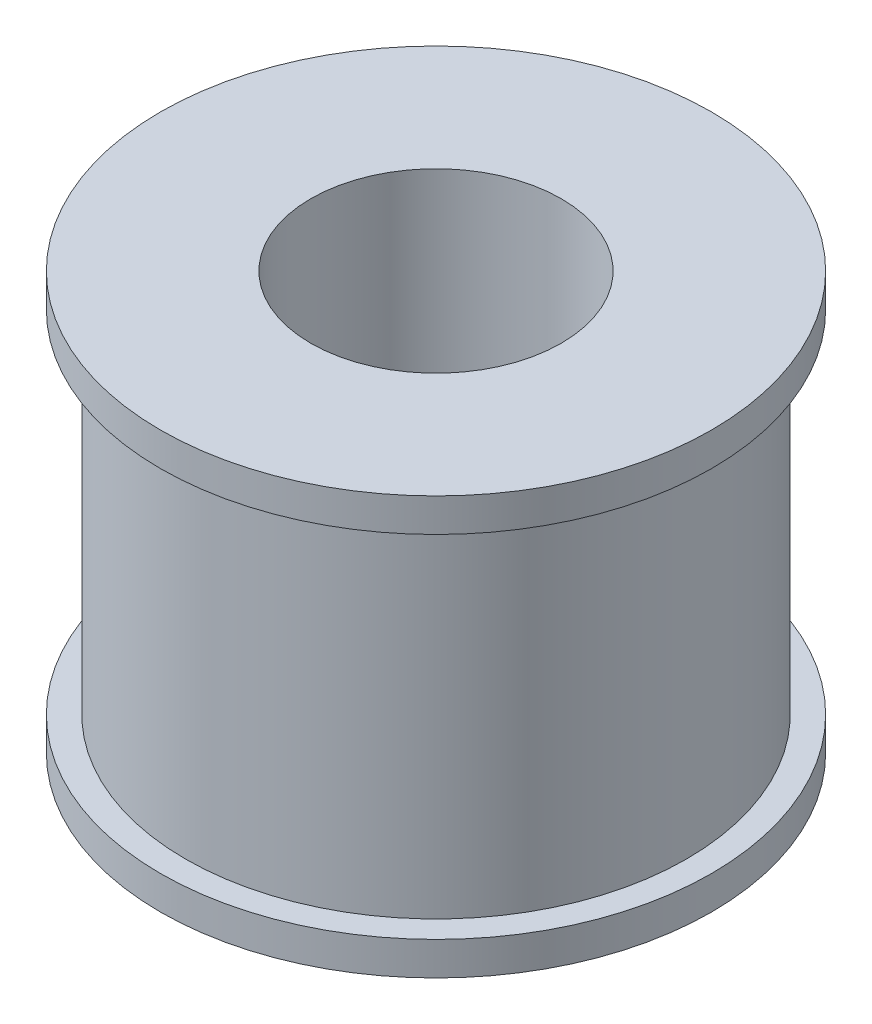
ISO-10303-21;
HEADER;
FILE_DESCRIPTION(('STEP AP214'),'2;1');
FILE_NAME('part.step','',(''),(''),'','','');
FILE_SCHEMA(('AUTOMOTIVE_DESIGN { 1 0 10303 214 1 1 1 1 }'));
ENDSEC;
DATA;
#1=APPLICATION_CONTEXT('core data for automotive mechanical design processes');
#2=APPLICATION_PROTOCOL_DEFINITION('international standard','automotive_design',2000,#1);
#3=PRODUCT_CONTEXT('',#1,'mechanical');
#4=PRODUCT('Part','Part','',(#3));
#5=PRODUCT_RELATED_PRODUCT_CATEGORY('part','',(#4));
#6=PRODUCT_DEFINITION_FORMATION('','',#4);
#7=PRODUCT_DEFINITION_CONTEXT('part definition',#1,'design');
#8=PRODUCT_DEFINITION('design','',#6,#7);
#9=PRODUCT_DEFINITION_SHAPE('','',#8);
#10=(LENGTH_UNIT() NAMED_UNIT(*) SI_UNIT(.MILLI.,.METRE.));
#11=(NAMED_UNIT(*) PLANE_ANGLE_UNIT() SI_UNIT($,.RADIAN.));
#12=(NAMED_UNIT(*) SI_UNIT($,.STERADIAN.) SOLID_ANGLE_UNIT());
#13=UNCERTAINTY_MEASURE_WITH_UNIT(LENGTH_MEASURE(1.E-05),#10,'distance_accuracy_value','');
#14=(GEOMETRIC_REPRESENTATION_CONTEXT(3) GLOBAL_UNCERTAINTY_ASSIGNED_CONTEXT((#13)) GLOBAL_UNIT_ASSIGNED_CONTEXT((#10,
#11,#12)) REPRESENTATION_CONTEXT('',''));
#15=CARTESIAN_POINT('',(0.,0.,0.));
#16=DIRECTION('',(0.,0.,1.));
#17=DIRECTION('',(1.,0.,0.));
#18=AXIS2_PLACEMENT_3D('',#15,#16,#17);
#19=CARTESIAN_POINT('',(0.,25.,0.));
#20=DIRECTION('',(0.,-1.,0.));
#21=DIRECTION('',(0.,0.,-1.));
#22=AXIS2_PLACEMENT_3D('',#19,#20,#21);
#23=CYLINDRICAL_SURFACE('',#22,3.);
#24=CARTESIAN_POINT('',(0.,0.,0.));
#25=DIRECTION('',(0.,1.,0.));
#26=DIRECTION('',(0.,0.,1.));
#27=AXIS2_PLACEMENT_3D('',#24,#25,#26);
#28=CIRCLE('',#27,3.);
#29=CARTESIAN_POINT('',(0.,0.,3.));
#30=VERTEX_POINT('',#29);
#31=EDGE_CURVE('E52',#30,#30,#28,.T.);
#32=ORIENTED_EDGE('',*,*,#31,.F.);
#33=EDGE_LOOP('',(#32));
#34=FACE_BOUND('',#33,.T.);
#35=CARTESIAN_POINT('',(1.625,5.,-2.521780125229));
#36=CARTESIAN_POINT('',(1.62499362610396,4.91647567107102,-2.52178884654117));
#37=CARTESIAN_POINT('',(1.61851585641467,4.83287244644267,-2.52599501945757));
#38=CARTESIAN_POINT('',(1.59297861462206,4.6683256364093,-2.54217064533891));
#39=CARTESIAN_POINT('',(1.57389710574364,4.58738697049031,-2.55415369499862));
#40=CARTESIAN_POINT('',(1.52427817740289,4.43087471587903,-2.58406681920894));
#41=CARTESIAN_POINT('',(1.49381028464491,4.35527181130049,-2.60196072584982));
#42=CARTESIAN_POINT('',(1.42249724665063,4.21027693964684,-2.64162110161326));
#43=CARTESIAN_POINT('',(1.38165016988108,4.14088613187722,-2.66338829131529));
#44=CARTESIAN_POINT('',(1.28606573612756,4.00281297757973,-2.71093173114226));
#45=CARTESIAN_POINT('',(1.23036059831293,3.93486364791188,-2.7368918673873));
#46=CARTESIAN_POINT('',(1.10864243894811,3.8086867522882,-2.78841941781855));
#47=CARTESIAN_POINT('',(1.04262348172815,3.75046482469484,-2.81398659649028));
#48=CARTESIAN_POINT('',(0.89551160217396,3.64066872614016,-2.86436429896294));
#49=CARTESIAN_POINT('',(0.813624236880456,3.59003997769905,-2.88893816491266));
#50=CARTESIAN_POINT('',(0.640911470519763,3.5036176638638,-2.9320863076302));
#51=CARTESIAN_POINT('',(0.550092737901573,3.46781313274385,-2.95066501686498));
#52=CARTESIAN_POINT('',(0.369897501143644,3.41510793344741,-2.97838863309815));
#53=CARTESIAN_POINT('',(0.281002067442789,3.39690896510625,-2.98817676403926));
#54=CARTESIAN_POINT('',(0.100927404427291,3.37561060880875,-2.99965505637116));
#55=CARTESIAN_POINT('',(0.00974989246369477,3.37250019032237,-3.00135113346747));
#56=CARTESIAN_POINT('',(-0.162347576331279,3.38107155998096,-2.99671477897577));
#57=CARTESIAN_POINT('',(-0.243368142517105,3.39128192920775,-2.99118088232813));
#58=CARTESIAN_POINT('',(-0.402336701214962,3.42350767664372,-2.97397337010464));
#59=CARTESIAN_POINT('',(-0.480284458564604,3.44552395648496,-2.96229928559631));
#60=CARTESIAN_POINT('',(-0.63207455464856,3.50076381349264,-2.93368734546312));
#61=CARTESIAN_POINT('',(-0.705859929075177,3.53411235165183,-2.91669097245024));
#62=CARTESIAN_POINT('',(-0.846938184886932,3.61083633152674,-2.87889510857995));
#63=CARTESIAN_POINT('',(-0.91422892621452,3.65421506242804,-2.85809437063173));
#64=CARTESIAN_POINT('',(-1.04801466719267,3.75499915650264,-2.8119717864549));
#65=CARTESIAN_POINT('',(-1.11367327603698,3.81340264002554,-2.78640445121692));
#66=CARTESIAN_POINT('',(-1.23475234459078,3.93995606194131,-2.73490853839924));
#67=CARTESIAN_POINT('',(-1.2901626002163,4.00811559576566,-2.7089796281294));
#68=CARTESIAN_POINT('',(-1.39377486129465,4.15911791911366,-2.65725751747602));
#69=CARTESIAN_POINT('',(-1.44098913960444,4.24271143567745,-2.63165629719171));
#70=CARTESIAN_POINT('',(-1.5203587042321,4.41828931014661,-2.58662109254775));
#71=CARTESIAN_POINT('',(-1.55253127212028,4.51026389300709,-2.56718003903186));
#72=CARTESIAN_POINT('',(-1.59812522493745,4.69228534022437,-2.53902859798761));
#73=CARTESIAN_POINT('',(-1.61285549939508,4.78188382300329,-2.52957594769987));
#74=CARTESIAN_POINT('',(-1.62709553982775,4.96273938431094,-2.52044556051586));
#75=CARTESIAN_POINT('',(-1.6266213251134,5.05399461596327,-2.52075753569134));
#76=CARTESIAN_POINT('',(-1.6116650884512,5.22196402891728,-2.53033241096107));
#77=CARTESIAN_POINT('',(-1.59913775035001,5.2989374702016,-2.53834610426687));
#78=CARTESIAN_POINT('',(-1.56351314461445,5.44948708742494,-2.56044192007669));
#79=CARTESIAN_POINT('',(-1.54041149876914,5.52306184225863,-2.57452655606692));
#80=CARTESIAN_POINT('',(-1.48330763694687,5.66842211919627,-2.60785937209035));
#81=CARTESIAN_POINT('',(-1.44887654692676,5.73999204648474,-2.62730481169378));
#82=CARTESIAN_POINT('',(-1.37044806619068,5.87676666541915,-2.66905325078274));
#83=CARTESIAN_POINT('',(-1.32644586554113,5.94196813265417,-2.69135768472439));
#84=CARTESIAN_POINT('',(-1.22230316396257,6.07459354253663,-2.74039556583206));
#85=CARTESIAN_POINT('',(-1.16072421643766,6.14083561603439,-2.76728512045753));
#86=CARTESIAN_POINT('',(-1.02707583252912,6.26250184432116,-2.81962198065225));
#87=CARTESIAN_POINT('',(-0.955000762805303,6.31792015229087,-2.84506850148092));
#88=CARTESIAN_POINT('',(-0.798115671580059,6.41870176479678,-2.89310153929838));
#89=CARTESIAN_POINT('',(-0.712872708944511,6.46348615652539,-2.91550295414492));
#90=CARTESIAN_POINT('',(-0.534505621432121,6.53760486976178,-2.9534021705525));
#91=CARTESIAN_POINT('',(-0.44138960806974,6.56695487331969,-2.96890697690612));
#92=CARTESIAN_POINT('',(-0.259992391421341,6.60647524542024,-2.98996496264615));
#93=CARTESIAN_POINT('',(-0.172164501552213,6.61827549628704,-2.99636104576615));
#94=CARTESIAN_POINT('',(0.00444487101537017,6.62739394717314,-3.00129434113477));
#95=CARTESIAN_POINT('',(0.093225862830992,6.62471927583816,-2.99983542183636));
#96=CARTESIAN_POINT('',(0.261188522805945,6.60590681183214,-2.98969237921464));
#97=CARTESIAN_POINT('',(0.340543637188175,6.59093537023404,-2.98163436789865));
#98=CARTESIAN_POINT('',(0.495432823547957,6.54970841054607,-2.95984216222459));
#99=CARTESIAN_POINT('',(0.570966424731545,6.52345150590093,-2.94610727040123));
#100=CARTESIAN_POINT('',(0.719186038389683,6.45950257807398,-2.91354409902028));
#101=CARTESIAN_POINT('',(0.791671383281743,6.42143261692066,-2.89455012777675));
#102=CARTESIAN_POINT('',(0.929476456393731,6.3354043604806,-2.8532886071291));
#103=CARTESIAN_POINT('',(0.99479316752873,6.287441925984,-2.83101968854409));
#104=CARTESIAN_POINT('',(1.12421459926918,6.17677982546555,-2.78234471532874));
#105=CARTESIAN_POINT('',(1.18735256260398,6.11302832046199,-2.75575528045836));
#106=CARTESIAN_POINT('',(1.30249662530647,5.97578738089303,-2.7032419755199));
#107=CARTESIAN_POINT('',(1.35448979132518,5.9022867910228,-2.67731890912275));
#108=CARTESIAN_POINT('',(1.44880285545911,5.74212188572276,-2.62754301941557));
#109=CARTESIAN_POINT('',(1.49035401575236,5.65493203097275,-2.60390811353569));
#110=CARTESIAN_POINT('',(1.55758520350058,5.47314904038028,-2.56427012470215));
#111=CARTESIAN_POINT('',(1.58331656006501,5.37858098159521,-2.54824239842196));
#112=CARTESIAN_POINT('',(1.60851613266538,5.2356472359366,-2.53234221331271));
#113=CARTESIAN_POINT('',(1.61468341643518,5.18882820241346,-2.52840291933054));
#114=CARTESIAN_POINT('',(1.62292718367799,5.0946812366103,-2.52311938607778));
#115=CARTESIAN_POINT('',(1.62500361361774,5.04735329767885,-2.52177518076675));
#116=CARTESIAN_POINT('',(1.625,5.,-2.521780125229));
#117=B_SPLINE_CURVE_WITH_KNOTS('',3,(#35,#36,#37,#38,#39,#40,#41,#42,#43,#44,#45,#46,#47,#48,
#49,#50,#51,#52,#53,#54,#55,#56,#57,#58,#59,#60,#61,#62,#63,#64,#65,#66,#67,#68,#69,#70,#71,#72,
#73,#74,#75,#76,#77,#78,#79,#80,#81,#82,#83,#84,#85,#86,#87,#88,#89,#90,#91,#92,#93,#94,#95,#96,
#97,#98,#99,#100,#101,#102,#103,#104,#105,#106,#107,#108,#109,#110,#111,#112,#113,#114,#115,
#116),.UNSPECIFIED.,.T.,.F.,(4,2,2,2,2,2,2,2,2,2,2,2,2,2,2,2,2,2,2,2,2,2,2,2,2,2,2,2,2,2,2,2,2,
2,2,2,2,2,2,2,4),(0.,0.250372371078242,0.501183664001882,0.750487850304348,0.999838465347706,
1.27357587393855,1.54747140449562,1.84397527167813,2.14025941634808,2.41249928639615,
2.68454010463896,2.92892931461192,3.17333719155109,3.42053266619159,3.66780931851591,
3.94123094413897,4.21492336171583,4.51146085049713,4.80765680207996,5.079836201185,
5.35172884399928,5.58585847738579,5.82008513815954,6.06445887718592,6.30895571043233,
6.59079991795693,6.87279595452077,7.16774738273199,7.46239854482431,7.72746451911719,
7.99239996494183,8.23476524078876,8.47716030264913,8.72828927356825,8.97952353584611,
9.25908071892252,9.53896058773721,9.83565375839589,10.1313791234398,10.2733234218883,
10.4152695778198),.UNSPECIFIED.);
#118=CARTESIAN_POINT('',(1.625,5.,-2.521780125229));
#119=VERTEX_POINT('',#118);
#120=EDGE_CURVE('E79',#119,#119,#117,.T.);
#121=ORIENTED_EDGE('',*,*,#120,.T.);
#122=EDGE_LOOP('',(#121));
#123=FACE_BOUND('',#122,.T.);
#124=CARTESIAN_POINT('',(0.,9.,0.));
#125=DIRECTION('',(0.,1.,0.));
#126=DIRECTION('',(0.,0.,1.));
#127=AXIS2_PLACEMENT_3D('',#124,#125,#126);
#128=CIRCLE('',#127,3.);
#129=CARTESIAN_POINT('',(0.,9.,3.));
#130=VERTEX_POINT('',#129);
#131=EDGE_CURVE('E41',#130,#130,#128,.T.);
#132=ORIENTED_EDGE('',*,*,#131,.T.);
#133=EDGE_LOOP('',(#132));
#134=FACE_BOUND('',#133,.T.);
#135=ADVANCED_FACE('F37',(#34,#123,#134),#23,.F.);
#136=CARTESIAN_POINT('',(0.,25.,0.));
#137=DIRECTION('',(0.,-1.,0.));
#138=DIRECTION('',(0.,0.,-1.));
#139=AXIS2_PLACEMENT_3D('',#136,#137,#138);
#140=CYLINDRICAL_SURFACE('',#139,15.);
#141=CARTESIAN_POINT('',(1.625,5.,-14.9117193844305));
#142=CARTESIAN_POINT('',(1.62499607951809,4.9090108416416,-14.9117205336342));
#143=CARTESIAN_POINT('',(1.61733206770543,4.81796253610688,-14.9125611691408));
#144=CARTESIAN_POINT('',(1.58687625220947,4.63839321362523,-14.915832168487));
#145=CARTESIAN_POINT('',(1.56406804372355,4.54987504600155,-14.9182642562102));
#146=CARTESIAN_POINT('',(1.50399836576417,4.37799225972297,-14.9244395173036));
#147=CARTESIAN_POINT('',(1.46674598159897,4.29462443966606,-14.9281818663832));
#148=CARTESIAN_POINT('',(1.37886351672704,4.13534161716927,-14.9365549747082));
#149=CARTESIAN_POINT('',(1.32823597825778,4.05942520218556,-14.9411855650784));
#150=CARTESIAN_POINT('',(1.21480991566068,3.91686096045494,-14.9508354029994));
#151=CARTESIAN_POINT('',(1.15196613450361,3.85024923206282,-14.9558560527334));
#152=CARTESIAN_POINT('',(1.01598848819612,3.7284963918019,-14.9657076223121));
#153=CARTESIAN_POINT('',(0.942854140085716,3.67335581860202,-14.9705385332384));
#154=CARTESIAN_POINT('',(0.788148146230986,3.5759840546106,-14.979480349489));
#155=CARTESIAN_POINT('',(0.706556115495929,3.53378507179415,-14.9835894477508));
#156=CARTESIAN_POINT('',(0.537392028738915,3.46370047953315,-14.9906093408174));
#157=CARTESIAN_POINT('',(0.449820142002624,3.43581446508836,-14.993520169528));
#158=CARTESIAN_POINT('',(0.271548635235109,3.39525397713153,-14.9978056971795));
#159=CARTESIAN_POINT('',(0.180862714678987,3.38251993717447,-14.9991864099331));
#160=CARTESIAN_POINT('',(-0.00136887809288493,3.37244046943757,-15.0002766179743));
#161=CARTESIAN_POINT('',(-0.0929145243656087,3.37509457878616,-14.99998616353));
#162=CARTESIAN_POINT('',(-0.273862279448701,3.39566790771732,-14.9977716675837));
#163=CARTESIAN_POINT('',(-0.36327176672863,3.41352307287695,-14.9958544809421));
#164=CARTESIAN_POINT('',(-0.537817561741082,3.46389177662204,-14.9906097658352));
#165=CARTESIAN_POINT('',(-0.622953805784831,3.49640553360832,-14.9872822163566));
#166=CARTESIAN_POINT('',(-0.786737204499769,3.57523805176723,-14.979579002581));
#167=CARTESIAN_POINT('',(-0.865370704832735,3.62158496440318,-14.9752012045523));
#168=CARTESIAN_POINT('',(-1.0137675205992,3.72674772430712,-14.9658882801973));
#169=CARTESIAN_POINT('',(-1.08353053033313,3.78556400111476,-14.9609531346744));
#170=CARTESIAN_POINT('',(-1.21258158390715,3.9143557017455,-14.9510489609166));
#171=CARTESIAN_POINT('',(-1.27181399609965,3.9843868798984,-14.9460798888296));
#172=CARTESIAN_POINT('',(-1.37769125065725,4.13342770218761,-14.9366931075787));
#173=CARTESIAN_POINT('',(-1.42433606915497,4.21243736334765,-14.9322753994602));
#174=CARTESIAN_POINT('',(-1.50371485192156,4.37723721180423,-14.9244913010396));
#175=CARTESIAN_POINT('',(-1.53644506541173,4.46302921994805,-14.9211251942686));
#176=CARTESIAN_POINT('',(-1.58701989180505,4.6389358914823,-14.9158311966687));
#177=CARTESIAN_POINT('',(-1.60486503894023,4.72905039961339,-14.9139032542237));
#178=CARTESIAN_POINT('',(-1.62509096228955,4.91055475629357,-14.9117129877457));
#179=CARTESIAN_POINT('',(-1.6275497095449,5.00193581884558,-14.9114422658505));
#180=CARTESIAN_POINT('',(-1.61713810395813,5.18380861017386,-14.9125749184418));
#181=CARTESIAN_POINT('',(-1.60426799494733,5.27430035307318,-14.9139782662994));
#182=CARTESIAN_POINT('',(-1.56362937642419,5.45159653584044,-14.9182932910546));
#183=CARTESIAN_POINT('',(-1.53589800835291,5.53840958838293,-14.9212012070943));
#184=CARTESIAN_POINT('',(-1.46636207739473,5.70615233356266,-14.9281946726837));
#185=CARTESIAN_POINT('',(-1.42455713824991,5.78708186883329,-14.9322802537179));
#186=CARTESIAN_POINT('',(-1.32786654917253,5.94111487230612,-14.941188975875));
#187=CARTESIAN_POINT('',(-1.27292939659526,6.01418584194673,-14.9460149935006));
#188=CARTESIAN_POINT('',(-1.15160734855488,6.15009731222767,-14.9558515297871));
#189=CARTESIAN_POINT('',(-1.08522212005016,6.2129375151363,-14.9608620538123));
#190=CARTESIAN_POINT('',(-0.942549364034599,6.32687408297659,-14.970528538951));
#191=CARTESIAN_POINT('',(-0.866221001315747,6.37791946791369,-14.9751829048162));
#192=CARTESIAN_POINT('',(-0.706029387134965,6.46646600456177,-14.9835892449075));
#193=CARTESIAN_POINT('',(-0.622166254347312,6.50396736954735,-14.9873412333428));
#194=CARTESIAN_POINT('',(-0.449460968850121,6.56427563446597,-14.9935129098066));
#195=CARTESIAN_POINT('',(-0.360629526752095,6.58711291323968,-14.995935350668));
#196=CARTESIAN_POINT('',(-0.180365296449006,6.6175437924483,-14.999186329398));
#197=CARTESIAN_POINT('',(-0.0889325950610979,6.62513790102089,-15.0000149203982));
#198=CARTESIAN_POINT('',(0.09343890925348,6.62485900793099,-14.9999847446418));
#199=CARTESIAN_POINT('',(0.18437784462988,6.61706497990256,-14.9991345933745));
#200=CARTESIAN_POINT('',(0.363646086561017,6.58639717389963,-14.9958594851579));
#201=CARTESIAN_POINT('',(0.451975392109846,6.56352339011256,-14.9934345276017));
#202=CARTESIAN_POINT('',(0.623513348873704,6.50336819065134,-14.9872813405323));
#203=CARTESIAN_POINT('',(0.706722983882575,6.46608955309469,-14.9835533623327));
#204=CARTESIAN_POINT('',(0.865716968282426,6.37819112870105,-14.9752088384087));
#205=CARTESIAN_POINT('',(0.941501319840049,6.32757134575692,-14.9705922929434));
#206=CARTESIAN_POINT('',(1.08389799384492,6.21413237859641,-14.960958916983));
#207=CARTESIAN_POINT('',(1.15046331474937,6.15125435063952,-14.9559402273796));
#208=CARTESIAN_POINT('',(1.27213126805333,6.01520254653594,-14.9460837090211));
#209=CARTESIAN_POINT('',(1.3272311582968,5.94202631439452,-14.9412459237589));
#210=CARTESIAN_POINT('',(1.42453604787585,5.78721552316423,-14.9322837858294));
#211=CARTESIAN_POINT('',(1.46670268012169,5.7055567413385,-14.9281615713388));
#212=CARTESIAN_POINT('',(1.53666786469777,5.53632304387261,-14.9211225978569));
#213=CARTESIAN_POINT('',(1.56448244506817,5.44875485190011,-14.9182044948746));
#214=CARTESIAN_POINT('',(1.59810281600453,5.30058619999483,-14.9146316623786));
#215=CARTESIAN_POINT('',(1.60817525625295,5.24092938535957,-14.913544806398));
#216=CARTESIAN_POINT('',(1.62162513312488,5.12085707759251,-14.9120882875807));
#217=CARTESIAN_POINT('',(1.62500260426801,5.06044158837411,-14.9117186210462));
#218=CARTESIAN_POINT('',(1.625,5.,-14.9117193844305));
#219=B_SPLINE_CURVE_WITH_KNOTS('',3,(#141,#142,#143,#144,#145,#146,#147,#148,#149,#150,#151,
#152,#153,#154,#155,#156,#157,#158,#159,#160,#161,#162,#163,#164,#165,#166,#167,#168,#169,#170,
#171,#172,#173,#174,#175,#176,#177,#178,#179,#180,#181,#182,#183,#184,#185,#186,#187,#188,#189,
#190,#191,#192,#193,#194,#195,#196,#197,#198,#199,#200,#201,#202,#203,#204,#205,#206,#207,#208,
#209,#210,#211,#212,#213,#214,#215,#216,#217,#218),.UNSPECIFIED.,.T.,.F.,(4,2,2,2,2,2,2,2,2,2,2,
2,2,2,2,2,2,2,2,2,2,2,2,2,2,2,2,2,2,2,2,2,2,2,2,2,2,2,4),(0.,0.272746729141454,
0.545789391564964,0.818660589509165,1.09147995964616,1.36532998736278,1.63919287178087,
1.91373189405753,2.18826314754028,2.46171154174663,2.73515171073829,3.00744532447488,
3.2797429952938,3.55259863422501,3.82546367390541,4.09972995287852,4.37399675188556,
4.64833743461444,4.92266827070322,5.1956077937417,5.46854297527464,5.74079919344049,
6.01306269097386,6.28641201040306,6.55976928331395,6.83428684697462,7.10880008768134,
7.38274278269506,7.65667634555892,7.92920770492192,8.20173916933351,8.4742180995881,
8.74669695033509,9.02051751499351,9.29440349349468,9.5690942792563,9.84347762910006,
10.0246566929585,10.2058348226453),.UNSPECIFIED.);
#220=CARTESIAN_POINT('',(1.625,5.,-14.9117193844305));
#221=VERTEX_POINT('',#220);
#222=EDGE_CURVE('E87',#221,#221,#219,.T.);
#223=ORIENTED_EDGE('',*,*,#222,.F.);
#224=EDGE_LOOP('',(#223));
#225=FACE_BOUND('',#224,.T.);
#226=CARTESIAN_POINT('',(0.,2.,0.));
#227=DIRECTION('',(0.,-1.,0.));
#228=DIRECTION('',(0.,0.,-1.));
#229=AXIS2_PLACEMENT_3D('',#226,#227,#228);
#230=CIRCLE('',#229,15.);
#231=CARTESIAN_POINT('',(0.,2.,-15.));
#232=VERTEX_POINT('',#231);
#233=EDGE_CURVE('E46',#232,#232,#230,.T.);
#234=ORIENTED_EDGE('',*,*,#233,.F.);
#235=EDGE_LOOP('',(#234));
#236=FACE_BOUND('',#235,.T.);
#237=CARTESIAN_POINT('',(0.,23.,0.));
#238=DIRECTION('',(0.,1.,0.));
#239=DIRECTION('',(0.,0.,1.));
#240=AXIS2_PLACEMENT_3D('',#237,#238,#239);
#241=CIRCLE('',#240,15.);
#242=CARTESIAN_POINT('',(0.,23.,15.));
#243=VERTEX_POINT('',#242);
#244=EDGE_CURVE('E10',#243,#243,#241,.T.);
#245=ORIENTED_EDGE('',*,*,#244,.F.);
#246=EDGE_LOOP('',(#245));
#247=FACE_BOUND('',#246,.T.);
#248=ADVANCED_FACE('F39',(#225,#236,#247),#140,.T.);
#249=CARTESIAN_POINT('',(0.,25.,0.));
#250=DIRECTION('',(0.,1.,0.));
#251=DIRECTION('',(0.,0.,1.));
#252=AXIS2_PLACEMENT_3D('',#249,#250,#251);
#253=PLANE('',#252);
#254=CARTESIAN_POINT('',(0.,25.,0.));
#255=DIRECTION('',(0.,1.,0.));
#256=DIRECTION('',(0.,0.,1.));
#257=AXIS2_PLACEMENT_3D('',#254,#255,#256);
#258=CIRCLE('',#257,7.5);
#259=CARTESIAN_POINT('',(0.,25.,7.5));
#260=VERTEX_POINT('',#259);
#261=EDGE_CURVE('E90',#260,#260,#258,.T.);
#262=ORIENTED_EDGE('',*,*,#261,.F.);
#263=EDGE_LOOP('',(#262));
#264=FACE_BOUND('',#263,.T.);
#265=CARTESIAN_POINT('',(0.,25.,0.));
#266=DIRECTION('',(0.,1.,0.));
#267=DIRECTION('',(0.,0.,1.));
#268=AXIS2_PLACEMENT_3D('',#265,#266,#267);
#269=CIRCLE('',#268,16.5);
#270=CARTESIAN_POINT('',(0.,25.,16.5));
#271=VERTEX_POINT('',#270);
#272=EDGE_CURVE('E56',#271,#271,#269,.T.);
#273=ORIENTED_EDGE('',*,*,#272,.T.);
#274=EDGE_LOOP('',(#273));
#275=FACE_BOUND('',#274,.T.);
#276=ADVANCED_FACE('F171',(#264,#275),#253,.T.);
#277=CARTESIAN_POINT('',(0.,0.,0.));
#278=DIRECTION('',(0.,1.,0.));
#279=DIRECTION('',(0.,0.,1.));
#280=AXIS2_PLACEMENT_3D('',#277,#278,#279);
#281=PLANE('',#280);
#282=ORIENTED_EDGE('',*,*,#31,.T.);
#283=EDGE_LOOP('',(#282));
#284=FACE_BOUND('',#283,.T.);
#285=CARTESIAN_POINT('',(0.,0.,0.));
#286=DIRECTION('',(0.,-1.,0.));
#287=DIRECTION('',(0.,0.,-1.));
#288=AXIS2_PLACEMENT_3D('',#285,#286,#287);
#289=CIRCLE('',#288,16.5);
#290=CARTESIAN_POINT('',(0.,0.,-16.5));
#291=VERTEX_POINT('',#290);
#292=EDGE_CURVE('E62',#291,#291,#289,.T.);
#293=ORIENTED_EDGE('',*,*,#292,.T.);
#294=EDGE_LOOP('',(#293));
#295=FACE_BOUND('',#294,.T.);
#296=ADVANCED_FACE('F70',(#284,#295),#281,.F.);
#297=CARTESIAN_POINT('',(0.,2.,0.));
#298=DIRECTION('',(0.,-1.,0.));
#299=DIRECTION('',(0.,0.,-1.));
#300=AXIS2_PLACEMENT_3D('',#297,#298,#299);
#301=PLANE('',#300);
#302=CARTESIAN_POINT('',(0.,2.,0.));
#303=DIRECTION('',(0.,-1.,0.));
#304=DIRECTION('',(0.,0.,-1.));
#305=AXIS2_PLACEMENT_3D('',#302,#303,#304);
#306=CIRCLE('',#305,16.5);
#307=CARTESIAN_POINT('',(0.,2.,-16.5));
#308=VERTEX_POINT('',#307);
#309=EDGE_CURVE('E58',#308,#308,#306,.T.);
#310=ORIENTED_EDGE('',*,*,#309,.F.);
#311=EDGE_LOOP('',(#310));
#312=FACE_BOUND('',#311,.T.);
#313=ORIENTED_EDGE('',*,*,#233,.T.);
#314=EDGE_LOOP('',(#313));
#315=FACE_BOUND('',#314,.T.);
#316=ADVANCED_FACE('F156',(#312,#315),#301,.F.);
#317=CARTESIAN_POINT('',(0.,2.,0.));
#318=DIRECTION('',(0.,-1.,0.));
#319=DIRECTION('',(0.,0.,-1.));
#320=AXIS2_PLACEMENT_3D('',#317,#318,#319);
#321=CYLINDRICAL_SURFACE('',#320,16.5);
#322=ORIENTED_EDGE('',*,*,#309,.T.);
#323=EDGE_LOOP('',(#322));
#324=FACE_BOUND('',#323,.T.);
#325=ORIENTED_EDGE('',*,*,#292,.F.);
#326=EDGE_LOOP('',(#325));
#327=FACE_BOUND('',#326,.T.);
#328=ADVANCED_FACE('F149',(#324,#327),#321,.T.);
#329=CARTESIAN_POINT('',(0.,23.,0.));
#330=DIRECTION('',(0.,1.,0.));
#331=DIRECTION('',(0.,0.,1.));
#332=AXIS2_PLACEMENT_3D('',#329,#330,#331);
#333=PLANE('',#332);
#334=CARTESIAN_POINT('',(0.,23.,0.));
#335=DIRECTION('',(0.,1.,0.));
#336=DIRECTION('',(0.,0.,1.));
#337=AXIS2_PLACEMENT_3D('',#334,#335,#336);
#338=CIRCLE('',#337,16.5);
#339=CARTESIAN_POINT('',(0.,23.,16.5));
#340=VERTEX_POINT('',#339);
#341=EDGE_CURVE('E65',#340,#340,#338,.T.);
#342=ORIENTED_EDGE('',*,*,#341,.F.);
#343=EDGE_LOOP('',(#342));
#344=FACE_BOUND('',#343,.T.);
#345=ORIENTED_EDGE('',*,*,#244,.T.);
#346=EDGE_LOOP('',(#345));
#347=FACE_BOUND('',#346,.T.);
#348=ADVANCED_FACE('F141',(#344,#347),#333,.F.);
#349=CARTESIAN_POINT('',(0.,23.,0.));
#350=DIRECTION('',(0.,1.,0.));
#351=DIRECTION('',(0.,0.,1.));
#352=AXIS2_PLACEMENT_3D('',#349,#350,#351);
#353=CYLINDRICAL_SURFACE('',#352,16.5);
#354=ORIENTED_EDGE('',*,*,#341,.T.);
#355=EDGE_LOOP('',(#354));
#356=FACE_BOUND('',#355,.T.);
#357=ORIENTED_EDGE('',*,*,#272,.F.);
#358=EDGE_LOOP('',(#357));
#359=FACE_BOUND('',#358,.T.);
#360=ADVANCED_FACE('F132',(#356,#359),#353,.T.);
#361=CARTESIAN_POINT('',(0.,5.,-16.501));
#362=DIRECTION('',(0.,0.,1.));
#363=DIRECTION('',(1.,0.,0.));
#364=AXIS2_PLACEMENT_3D('',#361,#362,#363);
#365=CYLINDRICAL_SURFACE('',#364,1.625);
#366=ORIENTED_EDGE('',*,*,#120,.F.);
#367=EDGE_LOOP('',(#366));
#368=FACE_BOUND('',#367,.T.);
#369=ORIENTED_EDGE('',*,*,#222,.T.);
#370=EDGE_LOOP('',(#369));
#371=FACE_BOUND('',#370,.T.);
#372=ADVANCED_FACE('F107',(#368,#371),#365,.F.);
#373=CARTESIAN_POINT('',(0.,9.,0.));
#374=DIRECTION('',(0.,1.,0.));
#375=DIRECTION('',(0.,0.,1.));
#376=AXIS2_PLACEMENT_3D('',#373,#374,#375);
#377=CYLINDRICAL_SURFACE('',#376,7.5);
#378=CARTESIAN_POINT('',(0.,9.,0.));
#379=DIRECTION('',(0.,1.,0.));
#380=DIRECTION('',(0.,0.,1.));
#381=AXIS2_PLACEMENT_3D('',#378,#379,#380);
#382=CIRCLE('',#381,7.5);
#383=CARTESIAN_POINT('',(0.,9.,7.5));
#384=VERTEX_POINT('',#383);
#385=EDGE_CURVE('E84',#384,#384,#382,.T.);
#386=ORIENTED_EDGE('',*,*,#385,.F.);
#387=EDGE_LOOP('',(#386));
#388=FACE_BOUND('',#387,.T.);
#389=ORIENTED_EDGE('',*,*,#261,.T.);
#390=EDGE_LOOP('',(#389));
#391=FACE_BOUND('',#390,.T.);
#392=ADVANCED_FACE('F112',(#388,#391),#377,.F.);
#393=CARTESIAN_POINT('',(0.,9.,0.));
#394=DIRECTION('',(0.,1.,0.));
#395=DIRECTION('',(0.,0.,1.));
#396=AXIS2_PLACEMENT_3D('',#393,#394,#395);
#397=PLANE('',#396);
#398=ORIENTED_EDGE('',*,*,#131,.F.);
#399=EDGE_LOOP('',(#398));
#400=FACE_BOUND('',#399,.T.);
#401=ORIENTED_EDGE('',*,*,#385,.T.);
#402=EDGE_LOOP('',(#401));
#403=FACE_BOUND('',#402,.T.);
#404=ADVANCED_FACE('F116',(#400,#403),#397,.T.);
#405=CLOSED_SHELL('',(#135,#248,#276,#296,#316,#328,#348,#360,#372,#392,#404));
#406=MANIFOLD_SOLID_BREP('B2',#405);
#407=ADVANCED_BREP_SHAPE_REPRESENTATION('',(#18,#406),#14);
#408=SHAPE_DEFINITION_REPRESENTATION(#9,#407);
ENDSEC;
END-ISO-10303-21;
